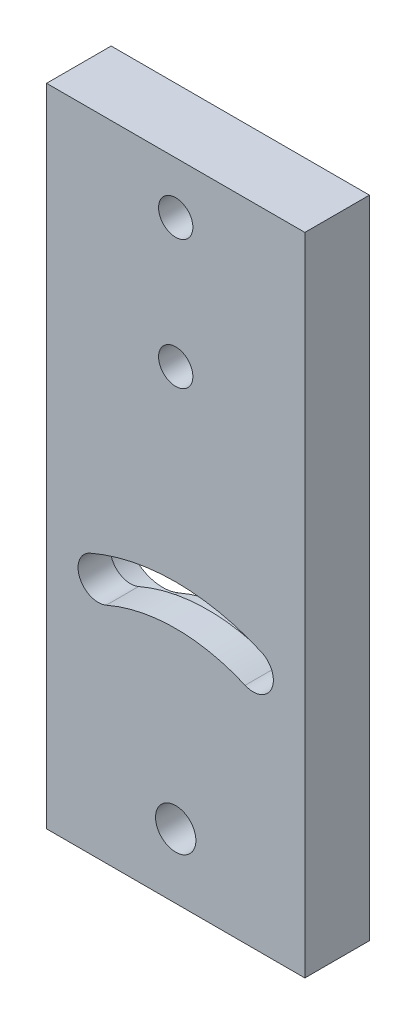
ISO-10303-21;
HEADER;
FILE_DESCRIPTION(('STEP AP214'),'2;1');
FILE_NAME('part.step','',(''),(''),'','','');
FILE_SCHEMA(('AUTOMOTIVE_DESIGN { 1 0 10303 214 1 1 1 1 }'));
ENDSEC;
DATA;
#1=APPLICATION_CONTEXT('core data for automotive mechanical design processes');
#2=APPLICATION_PROTOCOL_DEFINITION('international standard','automotive_design',2000,#1);
#3=PRODUCT_CONTEXT('',#1,'mechanical');
#4=PRODUCT('Part','Part','',(#3));
#5=PRODUCT_RELATED_PRODUCT_CATEGORY('part','',(#4));
#6=PRODUCT_DEFINITION_FORMATION('','',#4);
#7=PRODUCT_DEFINITION_CONTEXT('part definition',#1,'design');
#8=PRODUCT_DEFINITION('design','',#6,#7);
#9=PRODUCT_DEFINITION_SHAPE('','',#8);
#10=(LENGTH_UNIT() NAMED_UNIT(*) SI_UNIT(.MILLI.,.METRE.));
#11=(NAMED_UNIT(*) PLANE_ANGLE_UNIT() SI_UNIT($,.RADIAN.));
#12=(NAMED_UNIT(*) SI_UNIT($,.STERADIAN.) SOLID_ANGLE_UNIT());
#13=UNCERTAINTY_MEASURE_WITH_UNIT(LENGTH_MEASURE(1.E-05),#10,'distance_accuracy_value','');
#14=(GEOMETRIC_REPRESENTATION_CONTEXT(3) GLOBAL_UNCERTAINTY_ASSIGNED_CONTEXT((#13)) GLOBAL_UNIT_ASSIGNED_CONTEXT((#10,
#11,#12)) REPRESENTATION_CONTEXT('',''));
#15=CARTESIAN_POINT('',(0.,0.,0.));
#16=DIRECTION('',(0.,0.,1.));
#17=DIRECTION('',(1.,0.,0.));
#18=AXIS2_PLACEMENT_3D('',#15,#16,#17);
#19=CARTESIAN_POINT('',(0.,0.,12.7));
#20=DIRECTION('',(0.,0.,1.));
#21=DIRECTION('',(1.,0.,0.));
#22=AXIS2_PLACEMENT_3D('',#19,#20,#21);
#23=PLANE('',#22);
#24=CARTESIAN_POINT('',(25.4,116.84,12.7));
#25=DIRECTION('',(0.,0.,1.));
#26=DIRECTION('',(1.,0.,0.));
#27=AXIS2_PLACEMENT_3D('',#24,#25,#26);
#28=CIRCLE('',#27,3.3734375);
#29=CARTESIAN_POINT('',(28.7734375,116.84,12.7));
#30=VERTEX_POINT('',#29);
#31=EDGE_CURVE('E324',#30,#30,#28,.T.);
#32=ORIENTED_EDGE('',*,*,#31,.F.);
#33=EDGE_LOOP('',(#32));
#34=FACE_BOUND('',#33,.T.);
#35=DIRECTION('',(1.,0.,0.));
#36=VECTOR('',#35,1.);
#37=CARTESIAN_POINT('',(0.,127.,12.7));
#38=LINE('',#37,#36);
#39=CARTESIAN_POINT('',(0.,127.,12.7));
#40=VERTEX_POINT('',#39);
#41=CARTESIAN_POINT('',(50.8,127.,12.7));
#42=VERTEX_POINT('',#41);
#43=EDGE_CURVE('E264',#40,#42,#38,.T.);
#44=ORIENTED_EDGE('',*,*,#43,.F.);
#45=DIRECTION('',(0.,1.,0.));
#46=VECTOR('',#45,1.);
#47=CARTESIAN_POINT('',(0.,0.,12.7));
#48=LINE('',#47,#46);
#49=CARTESIAN_POINT('',(0.,0.,12.7));
#50=VERTEX_POINT('',#49);
#51=EDGE_CURVE('E275',#50,#40,#48,.T.);
#52=ORIENTED_EDGE('',*,*,#51,.F.);
#53=DIRECTION('',(1.,0.,0.));
#54=VECTOR('',#53,1.);
#55=CARTESIAN_POINT('',(0.,0.,12.7));
#56=LINE('',#55,#54);
#57=CARTESIAN_POINT('',(50.8,0.,12.7));
#58=VERTEX_POINT('',#57);
#59=EDGE_CURVE('E272',#50,#58,#56,.T.);
#60=ORIENTED_EDGE('',*,*,#59,.T.);
#61=DIRECTION('',(0.,1.,0.));
#62=VECTOR('',#61,1.);
#63=CARTESIAN_POINT('',(50.8,0.,12.7));
#64=LINE('',#63,#62);
#65=EDGE_CURVE('E268',#58,#42,#64,.T.);
#66=ORIENTED_EDGE('',*,*,#65,.T.);
#67=EDGE_LOOP('',(#44,#52,#60,#66));
#68=FACE_BOUND('',#67,.T.);
#69=CARTESIAN_POINT('',(25.4,12.7,12.7));
#70=DIRECTION('',(0.,0.,1.));
#71=DIRECTION('',(1.,0.,0.));
#72=AXIS2_PLACEMENT_3D('',#69,#70,#71);
#73=CIRCLE('',#72,34.13125);
#74=CARTESIAN_POINT('',(39.0525,43.9818073376923,12.7));
#75=VERTEX_POINT('',#74);
#76=CARTESIAN_POINT('',(11.7475,43.9818073376923,12.7));
#77=VERTEX_POINT('',#76);
#78=EDGE_CURVE('E323',#75,#77,#73,.T.);
#79=ORIENTED_EDGE('',*,*,#78,.T.);
#80=CARTESIAN_POINT('',(10.16,47.6192267955635,12.7));
#81=DIRECTION('',(0.,0.,1.));
#82=DIRECTION('',(1.,0.,0.));
#83=AXIS2_PLACEMENT_3D('',#80,#81,#82);
#84=CIRCLE('',#83,3.96875000000001);
#85=CARTESIAN_POINT('',(8.57249999999999,51.2566462534347,12.7));
#86=VERTEX_POINT('',#85);
#87=EDGE_CURVE('E251',#86,#77,#84,.T.);
#88=ORIENTED_EDGE('',*,*,#87,.F.);
#89=CARTESIAN_POINT('',(25.4,12.7,12.7));
#90=DIRECTION('',(0.,0.,1.));
#91=DIRECTION('',(1.,0.,0.));
#92=AXIS2_PLACEMENT_3D('',#89,#90,#91);
#93=CIRCLE('',#92,42.06875);
#94=CARTESIAN_POINT('',(42.2275,51.2566462534347,12.7));
#95=VERTEX_POINT('',#94);
#96=EDGE_CURVE('E260',#95,#86,#93,.T.);
#97=ORIENTED_EDGE('',*,*,#96,.F.);
#98=CARTESIAN_POINT('',(40.64,47.6192267955635,12.7));
#99=DIRECTION('',(0.,0.,1.));
#100=DIRECTION('',(1.,0.,0.));
#101=AXIS2_PLACEMENT_3D('',#98,#99,#100);
#102=CIRCLE('',#101,3.96875);
#103=EDGE_CURVE('E254',#75,#95,#102,.T.);
#104=ORIENTED_EDGE('',*,*,#103,.F.);
#105=EDGE_LOOP('',(#79,#88,#97,#104));
#106=FACE_BOUND('',#105,.T.);
#107=CARTESIAN_POINT('',(25.4,91.44,12.7));
#108=DIRECTION('',(0.,0.,1.));
#109=DIRECTION('',(1.,0.,0.));
#110=AXIS2_PLACEMENT_3D('',#107,#108,#109);
#111=CIRCLE('',#110,3.3734375);
#112=CARTESIAN_POINT('',(28.7734375,91.44,12.7));
#113=VERTEX_POINT('',#112);
#114=EDGE_CURVE('E320',#113,#113,#111,.T.);
#115=ORIENTED_EDGE('',*,*,#114,.F.);
#116=EDGE_LOOP('',(#115));
#117=FACE_BOUND('',#116,.T.);
#118=CARTESIAN_POINT('',(25.4,12.7,12.7));
#119=DIRECTION('',(0.,0.,1.));
#120=DIRECTION('',(1.,0.,0.));
#121=AXIS2_PLACEMENT_3D('',#118,#119,#120);
#122=CIRCLE('',#121,3.96875);
#123=CARTESIAN_POINT('',(29.36875,12.7,12.7));
#124=VERTEX_POINT('',#123);
#125=EDGE_CURVE('E330',#124,#124,#122,.T.);
#126=ORIENTED_EDGE('',*,*,#125,.F.);
#127=EDGE_LOOP('',(#126));
#128=FACE_BOUND('',#127,.T.);
#129=ADVANCED_FACE('F138',(#34,#68,#106,#117,#128),#23,.T.);
#130=CARTESIAN_POINT('',(0.,0.,0.));
#131=DIRECTION('',(0.,0.,1.));
#132=DIRECTION('',(1.,0.,0.));
#133=AXIS2_PLACEMENT_3D('',#130,#131,#132);
#134=PLANE('',#133);
#135=CARTESIAN_POINT('',(25.4,12.7,0.));
#136=DIRECTION('',(0.,0.,1.));
#137=DIRECTION('',(1.,0.,0.));
#138=AXIS2_PLACEMENT_3D('',#135,#136,#137);
#139=CIRCLE('',#138,7.62);
#140=CARTESIAN_POINT('',(33.02,12.7,0.));
#141=VERTEX_POINT('',#140);
#142=EDGE_CURVE('E419',#141,#141,#139,.T.);
#143=ORIENTED_EDGE('',*,*,#142,.T.);
#144=EDGE_LOOP('',(#143));
#145=FACE_BOUND('',#144,.T.);
#146=CARTESIAN_POINT('',(25.4,116.84,0.));
#147=DIRECTION('',(0.,0.,1.));
#148=DIRECTION('',(1.,0.,0.));
#149=AXIS2_PLACEMENT_3D('',#146,#147,#148);
#150=CIRCLE('',#149,5.55625);
#151=CARTESIAN_POINT('',(30.95625,116.84,0.));
#152=VERTEX_POINT('',#151);
#153=EDGE_CURVE('E412',#152,#152,#150,.T.);
#154=ORIENTED_EDGE('',*,*,#153,.T.);
#155=EDGE_LOOP('',(#154));
#156=FACE_BOUND('',#155,.T.);
#157=CARTESIAN_POINT('',(25.4,91.44,0.));
#158=DIRECTION('',(0.,0.,1.));
#159=DIRECTION('',(1.,0.,0.));
#160=AXIS2_PLACEMENT_3D('',#157,#158,#159);
#161=CIRCLE('',#160,5.55625);
#162=CARTESIAN_POINT('',(30.95625,91.44,0.));
#163=VERTEX_POINT('',#162);
#164=EDGE_CURVE('E408',#163,#163,#161,.T.);
#165=ORIENTED_EDGE('',*,*,#164,.T.);
#166=EDGE_LOOP('',(#165));
#167=FACE_BOUND('',#166,.T.);
#168=CARTESIAN_POINT('',(10.16,47.6192267955635,0.));
#169=DIRECTION('',(0.,0.,1.));
#170=DIRECTION('',(1.,0.,0.));
#171=AXIS2_PLACEMENT_3D('',#168,#169,#170);
#172=CIRCLE('',#171,7.77875000000001);
#173=CARTESIAN_POINT('',(7.0485,54.7485689329911,0.));
#174=VERTEX_POINT('',#173);
#175=CARTESIAN_POINT('',(13.2715,40.4898846581359,0.));
#176=VERTEX_POINT('',#175);
#177=EDGE_CURVE('E383',#174,#176,#172,.T.);
#178=ORIENTED_EDGE('',*,*,#177,.T.);
#179=CARTESIAN_POINT('',(25.4,12.7,0.));
#180=DIRECTION('',(0.,0.,1.));
#181=DIRECTION('',(1.,0.,0.));
#182=AXIS2_PLACEMENT_3D('',#179,#180,#181);
#183=CIRCLE('',#182,30.32125);
#184=CARTESIAN_POINT('',(37.5285,40.4898846581359,0.));
#185=VERTEX_POINT('',#184);
#186=EDGE_CURVE('E156',#185,#176,#183,.T.);
#187=ORIENTED_EDGE('',*,*,#186,.F.);
#188=CARTESIAN_POINT('',(40.64,47.6192267955635,0.));
#189=DIRECTION('',(0.,0.,1.));
#190=DIRECTION('',(1.,0.,0.));
#191=AXIS2_PLACEMENT_3D('',#188,#189,#190);
#192=CIRCLE('',#191,7.77875);
#193=CARTESIAN_POINT('',(43.7515,54.7485689329911,0.));
#194=VERTEX_POINT('',#193);
#195=EDGE_CURVE('E374',#185,#194,#192,.T.);
#196=ORIENTED_EDGE('',*,*,#195,.T.);
#197=CARTESIAN_POINT('',(25.4,12.7,0.));
#198=DIRECTION('',(0.,0.,1.));
#199=DIRECTION('',(1.,0.,0.));
#200=AXIS2_PLACEMENT_3D('',#197,#198,#199);
#201=CIRCLE('',#200,45.87875);
#202=EDGE_CURVE('E379',#194,#174,#201,.T.);
#203=ORIENTED_EDGE('',*,*,#202,.T.);
#204=EDGE_LOOP('',(#178,#187,#196,#203));
#205=FACE_BOUND('',#204,.T.);
#206=DIRECTION('',(1.,0.,0.));
#207=VECTOR('',#206,1.);
#208=CARTESIAN_POINT('',(0.,127.,0.));
#209=LINE('',#208,#207);
#210=CARTESIAN_POINT('',(0.,127.,0.));
#211=VERTEX_POINT('',#210);
#212=CARTESIAN_POINT('',(50.8,127.,0.));
#213=VERTEX_POINT('',#212);
#214=EDGE_CURVE('E280',#211,#213,#209,.T.);
#215=ORIENTED_EDGE('',*,*,#214,.T.);
#216=DIRECTION('',(0.,1.,0.));
#217=VECTOR('',#216,1.);
#218=CARTESIAN_POINT('',(50.8,0.,0.));
#219=LINE('',#218,#217);
#220=CARTESIAN_POINT('',(50.8,0.,0.));
#221=VERTEX_POINT('',#220);
#222=EDGE_CURVE('E284',#221,#213,#219,.T.);
#223=ORIENTED_EDGE('',*,*,#222,.F.);
#224=DIRECTION('',(1.,0.,0.));
#225=VECTOR('',#224,1.);
#226=CARTESIAN_POINT('',(0.,0.,0.));
#227=LINE('',#226,#225);
#228=CARTESIAN_POINT('',(0.,0.,0.));
#229=VERTEX_POINT('',#228);
#230=EDGE_CURVE('E288',#229,#221,#227,.T.);
#231=ORIENTED_EDGE('',*,*,#230,.F.);
#232=DIRECTION('',(0.,1.,0.));
#233=VECTOR('',#232,1.);
#234=CARTESIAN_POINT('',(0.,0.,0.));
#235=LINE('',#234,#233);
#236=EDGE_CURVE('E269',#229,#211,#235,.T.);
#237=ORIENTED_EDGE('',*,*,#236,.T.);
#238=EDGE_LOOP('',(#215,#223,#231,#237));
#239=FACE_BOUND('',#238,.T.);
#240=ADVANCED_FACE('F352',(#145,#156,#167,#205,#239),#134,.F.);
#241=CARTESIAN_POINT('',(0.,127.,12.7));
#242=DIRECTION('',(0.,1.,0.));
#243=DIRECTION('',(0.,0.,1.));
#244=AXIS2_PLACEMENT_3D('',#241,#242,#243);
#245=PLANE('',#244);
#246=ORIENTED_EDGE('',*,*,#214,.F.);
#247=DIRECTION('',(0.,0.,-1.));
#248=VECTOR('',#247,1.);
#249=CARTESIAN_POINT('',(0.,127.,12.7));
#250=LINE('',#249,#248);
#251=EDGE_CURVE('E12',#40,#211,#250,.T.);
#252=ORIENTED_EDGE('',*,*,#251,.F.);
#253=ORIENTED_EDGE('',*,*,#43,.T.);
#254=DIRECTION('',(0.,0.,-1.));
#255=VECTOR('',#254,1.);
#256=CARTESIAN_POINT('',(50.8,127.,12.7));
#257=LINE('',#256,#255);
#258=EDGE_CURVE('E279',#42,#213,#257,.T.);
#259=ORIENTED_EDGE('',*,*,#258,.T.);
#260=EDGE_LOOP('',(#246,#252,#253,#259));
#261=FACE_BOUND('',#260,.T.);
#262=ADVANCED_FACE('F140',(#261),#245,.T.);
#263=CARTESIAN_POINT('',(0.,0.,12.7));
#264=DIRECTION('',(-1.,0.,0.));
#265=DIRECTION('',(0.,0.,1.));
#266=AXIS2_PLACEMENT_3D('',#263,#264,#265);
#267=PLANE('',#266);
#268=ORIENTED_EDGE('',*,*,#236,.F.);
#269=DIRECTION('',(0.,0.,-1.));
#270=VECTOR('',#269,1.);
#271=CARTESIAN_POINT('',(0.,0.,12.7));
#272=LINE('',#271,#270);
#273=EDGE_CURVE('E148',#50,#229,#272,.T.);
#274=ORIENTED_EDGE('',*,*,#273,.F.);
#275=ORIENTED_EDGE('',*,*,#51,.T.);
#276=ORIENTED_EDGE('',*,*,#251,.T.);
#277=EDGE_LOOP('',(#268,#274,#275,#276));
#278=FACE_BOUND('',#277,.T.);
#279=ADVANCED_FACE('F462',(#278),#267,.T.);
#280=CARTESIAN_POINT('',(0.,0.,12.7));
#281=DIRECTION('',(0.,1.,0.));
#282=DIRECTION('',(0.,0.,1.));
#283=AXIS2_PLACEMENT_3D('',#280,#281,#282);
#284=PLANE('',#283);
#285=ORIENTED_EDGE('',*,*,#230,.T.);
#286=DIRECTION('',(0.,0.,-1.));
#287=VECTOR('',#286,1.);
#288=CARTESIAN_POINT('',(50.8,0.,12.7));
#289=LINE('',#288,#287);
#290=EDGE_CURVE('E296',#58,#221,#289,.T.);
#291=ORIENTED_EDGE('',*,*,#290,.F.);
#292=ORIENTED_EDGE('',*,*,#59,.F.);
#293=ORIENTED_EDGE('',*,*,#273,.T.);
#294=EDGE_LOOP('',(#285,#291,#292,#293));
#295=FACE_BOUND('',#294,.T.);
#296=ADVANCED_FACE('F465',(#295),#284,.F.);
#297=CARTESIAN_POINT('',(50.8,0.,12.7));
#298=DIRECTION('',(-1.,0.,0.));
#299=DIRECTION('',(0.,0.,1.));
#300=AXIS2_PLACEMENT_3D('',#297,#298,#299);
#301=PLANE('',#300);
#302=ORIENTED_EDGE('',*,*,#222,.T.);
#303=ORIENTED_EDGE('',*,*,#258,.F.);
#304=ORIENTED_EDGE('',*,*,#65,.F.);
#305=ORIENTED_EDGE('',*,*,#290,.T.);
#306=EDGE_LOOP('',(#302,#303,#304,#305));
#307=FACE_BOUND('',#306,.T.);
#308=ADVANCED_FACE('F458',(#307),#301,.F.);
#309=CARTESIAN_POINT('',(25.4,12.7,12.7));
#310=DIRECTION('',(0.,0.,-1.));
#311=DIRECTION('',(-1.,0.,0.));
#312=AXIS2_PLACEMENT_3D('',#309,#310,#311);
#313=CYLINDRICAL_SURFACE('',#312,34.13125);
#314=DIRECTION('',(0.,0.,-1.));
#315=VECTOR('',#314,1.);
#316=CARTESIAN_POINT('',(39.0525,43.9818073376923,12.7));
#317=LINE('',#316,#315);
#318=CARTESIAN_POINT('',(39.0525,43.9818073376923,6.35));
#319=VERTEX_POINT('',#318);
#320=EDGE_CURVE('E245',#75,#319,#317,.T.);
#321=ORIENTED_EDGE('',*,*,#320,.T.);
#322=CARTESIAN_POINT('',(25.4,12.7,6.35));
#323=DIRECTION('',(0.,0.,1.));
#324=DIRECTION('',(1.,0.,0.));
#325=AXIS2_PLACEMENT_3D('',#322,#323,#324);
#326=CIRCLE('',#325,34.13125);
#327=CARTESIAN_POINT('',(11.7475,43.9818073376923,6.35));
#328=VERTEX_POINT('',#327);
#329=EDGE_CURVE('E231',#319,#328,#326,.T.);
#330=ORIENTED_EDGE('',*,*,#329,.T.);
#331=DIRECTION('',(0.,0.,-1.));
#332=VECTOR('',#331,1.);
#333=CARTESIAN_POINT('',(11.7475,43.9818073376923,12.7));
#334=LINE('',#333,#332);
#335=EDGE_CURVE('E243',#77,#328,#334,.T.);
#336=ORIENTED_EDGE('',*,*,#335,.F.);
#337=ORIENTED_EDGE('',*,*,#78,.F.);
#338=EDGE_LOOP('',(#321,#330,#336,#337));
#339=FACE_BOUND('',#338,.T.);
#340=ADVANCED_FACE('F241',(#339),#313,.T.);
#341=CARTESIAN_POINT('',(40.64,47.6192267955635,12.7));
#342=DIRECTION('',(0.,0.,-1.));
#343=DIRECTION('',(-1.,0.,0.));
#344=AXIS2_PLACEMENT_3D('',#341,#342,#343);
#345=CYLINDRICAL_SURFACE('',#344,3.96875);
#346=CARTESIAN_POINT('',(40.64,47.6192267955635,6.35));
#347=DIRECTION('',(0.,0.,1.));
#348=DIRECTION('',(1.,0.,0.));
#349=AXIS2_PLACEMENT_3D('',#346,#347,#348);
#350=CIRCLE('',#349,3.96875);
#351=CARTESIAN_POINT('',(42.2275,51.2566462534347,6.35));
#352=VERTEX_POINT('',#351);
#353=EDGE_CURVE('E345',#319,#352,#350,.T.);
#354=ORIENTED_EDGE('',*,*,#353,.F.);
#355=ORIENTED_EDGE('',*,*,#320,.F.);
#356=ORIENTED_EDGE('',*,*,#103,.T.);
#357=DIRECTION('',(0.,0.,-1.));
#358=VECTOR('',#357,1.);
#359=CARTESIAN_POINT('',(42.2275,51.2566462534347,12.7));
#360=LINE('',#359,#358);
#361=EDGE_CURVE('E258',#95,#352,#360,.T.);
#362=ORIENTED_EDGE('',*,*,#361,.T.);
#363=EDGE_LOOP('',(#354,#355,#356,#362));
#364=FACE_BOUND('',#363,.T.);
#365=ADVANCED_FACE('F344',(#364),#345,.F.);
#366=CARTESIAN_POINT('',(25.4,12.7,12.7));
#367=DIRECTION('',(0.,0.,-1.));
#368=DIRECTION('',(-1.,0.,0.));
#369=AXIS2_PLACEMENT_3D('',#366,#367,#368);
#370=CYLINDRICAL_SURFACE('',#369,42.06875);
#371=CARTESIAN_POINT('',(25.4,12.7,6.35));
#372=DIRECTION('',(0.,0.,1.));
#373=DIRECTION('',(1.,0.,0.));
#374=AXIS2_PLACEMENT_3D('',#371,#372,#373);
#375=CIRCLE('',#374,42.06875);
#376=CARTESIAN_POINT('',(8.5725,51.2566462534347,6.35));
#377=VERTEX_POINT('',#376);
#378=EDGE_CURVE('E164',#352,#377,#375,.T.);
#379=ORIENTED_EDGE('',*,*,#378,.F.);
#380=ORIENTED_EDGE('',*,*,#361,.F.);
#381=ORIENTED_EDGE('',*,*,#96,.T.);
#382=DIRECTION('',(0.,0.,-1.));
#383=VECTOR('',#382,1.);
#384=CARTESIAN_POINT('',(8.5725,51.2566462534347,12.7));
#385=LINE('',#384,#383);
#386=EDGE_CURVE('E253',#86,#377,#385,.T.);
#387=ORIENTED_EDGE('',*,*,#386,.T.);
#388=EDGE_LOOP('',(#379,#380,#381,#387));
#389=FACE_BOUND('',#388,.T.);
#390=ADVANCED_FACE('F349',(#389),#370,.F.);
#391=CARTESIAN_POINT('',(10.16,47.6192267955635,12.7));
#392=DIRECTION('',(0.,0.,-1.));
#393=DIRECTION('',(-1.,0.,0.));
#394=AXIS2_PLACEMENT_3D('',#391,#392,#393);
#395=CYLINDRICAL_SURFACE('',#394,3.96875000000001);
#396=CARTESIAN_POINT('',(10.16,47.6192267955635,6.35));
#397=DIRECTION('',(0.,0.,1.));
#398=DIRECTION('',(1.,0.,0.));
#399=AXIS2_PLACEMENT_3D('',#396,#397,#398);
#400=CIRCLE('',#399,3.96875000000001);
#401=EDGE_CURVE('E227',#377,#328,#400,.T.);
#402=ORIENTED_EDGE('',*,*,#401,.F.);
#403=ORIENTED_EDGE('',*,*,#386,.F.);
#404=ORIENTED_EDGE('',*,*,#87,.T.);
#405=ORIENTED_EDGE('',*,*,#335,.T.);
#406=EDGE_LOOP('',(#402,#403,#404,#405));
#407=FACE_BOUND('',#406,.T.);
#408=ADVANCED_FACE('F249',(#407),#395,.F.);
#409=CARTESIAN_POINT('',(25.4,91.44,12.7));
#410=DIRECTION('',(0.,0.,-1.));
#411=DIRECTION('',(-1.,0.,0.));
#412=AXIS2_PLACEMENT_3D('',#409,#410,#411);
#413=CYLINDRICAL_SURFACE('',#412,3.3734375);
#414=CARTESIAN_POINT('',(25.4,91.44,6.35));
#415=DIRECTION('',(0.,0.,1.));
#416=DIRECTION('',(1.,0.,0.));
#417=AXIS2_PLACEMENT_3D('',#414,#415,#416);
#418=CIRCLE('',#417,3.3734375);
#419=CARTESIAN_POINT('',(28.7734375,91.44,6.35));
#420=VERTEX_POINT('',#419);
#421=EDGE_CURVE('E247',#420,#420,#418,.T.);
#422=ORIENTED_EDGE('',*,*,#421,.F.);
#423=EDGE_LOOP('',(#422));
#424=FACE_BOUND('',#423,.T.);
#425=ORIENTED_EDGE('',*,*,#114,.T.);
#426=EDGE_LOOP('',(#425));
#427=FACE_BOUND('',#426,.T.);
#428=ADVANCED_FACE('F313',(#424,#427),#413,.F.);
#429=CARTESIAN_POINT('',(25.4,116.84,12.7));
#430=DIRECTION('',(0.,0.,-1.));
#431=DIRECTION('',(-1.,0.,0.));
#432=AXIS2_PLACEMENT_3D('',#429,#430,#431);
#433=CYLINDRICAL_SURFACE('',#432,3.3734375);
#434=CARTESIAN_POINT('',(25.4,116.84,6.35));
#435=DIRECTION('',(0.,0.,1.));
#436=DIRECTION('',(1.,0.,0.));
#437=AXIS2_PLACEMENT_3D('',#434,#435,#436);
#438=CIRCLE('',#437,3.3734375);
#439=CARTESIAN_POINT('',(28.7734375,116.84,6.35));
#440=VERTEX_POINT('',#439);
#441=EDGE_CURVE('E302',#440,#440,#438,.T.);
#442=ORIENTED_EDGE('',*,*,#441,.F.);
#443=EDGE_LOOP('',(#442));
#444=FACE_BOUND('',#443,.T.);
#445=ORIENTED_EDGE('',*,*,#31,.T.);
#446=EDGE_LOOP('',(#445));
#447=FACE_BOUND('',#446,.T.);
#448=ADVANCED_FACE('F316',(#444,#447),#433,.F.);
#449=CARTESIAN_POINT('',(25.4,12.7,12.7));
#450=DIRECTION('',(0.,0.,-1.));
#451=DIRECTION('',(-1.,0.,0.));
#452=AXIS2_PLACEMENT_3D('',#449,#450,#451);
#453=CYLINDRICAL_SURFACE('',#452,3.96875);
#454=CARTESIAN_POINT('',(25.4,12.7,6.35));
#455=DIRECTION('',(0.,0.,1.));
#456=DIRECTION('',(1.,0.,0.));
#457=AXIS2_PLACEMENT_3D('',#454,#455,#456);
#458=CIRCLE('',#457,3.96875);
#459=CARTESIAN_POINT('',(29.36875,12.7,6.35));
#460=VERTEX_POINT('',#459);
#461=EDGE_CURVE('E142',#460,#460,#458,.T.);
#462=ORIENTED_EDGE('',*,*,#461,.F.);
#463=EDGE_LOOP('',(#462));
#464=FACE_BOUND('',#463,.T.);
#465=ORIENTED_EDGE('',*,*,#125,.T.);
#466=EDGE_LOOP('',(#465));
#467=FACE_BOUND('',#466,.T.);
#468=ADVANCED_FACE('F435',(#464,#467),#453,.F.);
#469=CARTESIAN_POINT('',(25.4,12.7,6.35));
#470=DIRECTION('',(0.,0.,-1.));
#471=DIRECTION('',(-1.,0.,0.));
#472=AXIS2_PLACEMENT_3D('',#469,#470,#471);
#473=CYLINDRICAL_SURFACE('',#472,30.32125);
#474=ORIENTED_EDGE('',*,*,#186,.T.);
#475=DIRECTION('',(0.,0.,-1.));
#476=VECTOR('',#475,1.);
#477=CARTESIAN_POINT('',(13.2715,40.4898846581359,6.35));
#478=LINE('',#477,#476);
#479=CARTESIAN_POINT('',(13.2715,40.4898846581359,6.35));
#480=VERTEX_POINT('',#479);
#481=EDGE_CURVE('E365',#480,#176,#478,.T.);
#482=ORIENTED_EDGE('',*,*,#481,.F.);
#483=CARTESIAN_POINT('',(25.4,12.7,6.35));
#484=DIRECTION('',(0.,0.,1.));
#485=DIRECTION('',(1.,0.,0.));
#486=AXIS2_PLACEMENT_3D('',#483,#484,#485);
#487=CIRCLE('',#486,30.32125);
#488=CARTESIAN_POINT('',(37.5285,40.4898846581359,6.35));
#489=VERTEX_POINT('',#488);
#490=EDGE_CURVE('E378',#489,#480,#487,.T.);
#491=ORIENTED_EDGE('',*,*,#490,.F.);
#492=DIRECTION('',(0.,0.,-1.));
#493=VECTOR('',#492,1.);
#494=CARTESIAN_POINT('',(37.5285,40.4898846581359,6.35));
#495=LINE('',#494,#493);
#496=EDGE_CURVE('E360',#489,#185,#495,.T.);
#497=ORIENTED_EDGE('',*,*,#496,.T.);
#498=EDGE_LOOP('',(#474,#482,#491,#497));
#499=FACE_BOUND('',#498,.T.);
#500=ADVANCED_FACE('F437',(#499),#473,.T.);
#501=CARTESIAN_POINT('',(40.64,47.6192267955635,6.35));
#502=DIRECTION('',(0.,0.,-1.));
#503=DIRECTION('',(-1.,0.,0.));
#504=AXIS2_PLACEMENT_3D('',#501,#502,#503);
#505=CYLINDRICAL_SURFACE('',#504,7.77875);
#506=ORIENTED_EDGE('',*,*,#195,.F.);
#507=ORIENTED_EDGE('',*,*,#496,.F.);
#508=CARTESIAN_POINT('',(40.64,47.6192267955635,6.35));
#509=DIRECTION('',(0.,0.,1.));
#510=DIRECTION('',(1.,0.,0.));
#511=AXIS2_PLACEMENT_3D('',#508,#509,#510);
#512=CIRCLE('',#511,7.77875);
#513=CARTESIAN_POINT('',(43.7515,54.7485689329911,6.35));
#514=VERTEX_POINT('',#513);
#515=EDGE_CURVE('E369',#489,#514,#512,.T.);
#516=ORIENTED_EDGE('',*,*,#515,.T.);
#517=DIRECTION('',(0.,0.,-1.));
#518=VECTOR('',#517,1.);
#519=CARTESIAN_POINT('',(43.7515,54.7485689329911,6.35));
#520=LINE('',#519,#518);
#521=EDGE_CURVE('E362',#514,#194,#520,.T.);
#522=ORIENTED_EDGE('',*,*,#521,.T.);
#523=EDGE_LOOP('',(#506,#507,#516,#522));
#524=FACE_BOUND('',#523,.T.);
#525=ADVANCED_FACE('F444',(#524),#505,.F.);
#526=CARTESIAN_POINT('',(25.4,12.7,6.35));
#527=DIRECTION('',(0.,0.,-1.));
#528=DIRECTION('',(-1.,0.,0.));
#529=AXIS2_PLACEMENT_3D('',#526,#527,#528);
#530=CYLINDRICAL_SURFACE('',#529,45.87875);
#531=ORIENTED_EDGE('',*,*,#202,.F.);
#532=ORIENTED_EDGE('',*,*,#521,.F.);
#533=CARTESIAN_POINT('',(25.4,12.7,6.35));
#534=DIRECTION('',(0.,0.,1.));
#535=DIRECTION('',(1.,0.,0.));
#536=AXIS2_PLACEMENT_3D('',#533,#534,#535);
#537=CIRCLE('',#536,45.87875);
#538=CARTESIAN_POINT('',(7.0485,54.7485689329911,6.35));
#539=VERTEX_POINT('',#538);
#540=EDGE_CURVE('E391',#514,#539,#537,.T.);
#541=ORIENTED_EDGE('',*,*,#540,.T.);
#542=DIRECTION('',(0.,0.,-1.));
#543=VECTOR('',#542,1.);
#544=CARTESIAN_POINT('',(7.0485,54.7485689329911,6.35));
#545=LINE('',#544,#543);
#546=EDGE_CURVE('E368',#539,#174,#545,.T.);
#547=ORIENTED_EDGE('',*,*,#546,.T.);
#548=EDGE_LOOP('',(#531,#532,#541,#547));
#549=FACE_BOUND('',#548,.T.);
#550=ADVANCED_FACE('F564',(#549),#530,.F.);
#551=CARTESIAN_POINT('',(10.16,47.6192267955635,6.35));
#552=DIRECTION('',(0.,0.,-1.));
#553=DIRECTION('',(-1.,0.,0.));
#554=AXIS2_PLACEMENT_3D('',#551,#552,#553);
#555=CYLINDRICAL_SURFACE('',#554,7.77875000000001);
#556=ORIENTED_EDGE('',*,*,#177,.F.);
#557=ORIENTED_EDGE('',*,*,#546,.F.);
#558=CARTESIAN_POINT('',(10.16,47.6192267955635,6.35));
#559=DIRECTION('',(0.,0.,1.));
#560=DIRECTION('',(1.,0.,0.));
#561=AXIS2_PLACEMENT_3D('',#558,#559,#560);
#562=CIRCLE('',#561,7.77875000000001);
#563=EDGE_CURVE('E394',#539,#480,#562,.T.);
#564=ORIENTED_EDGE('',*,*,#563,.T.);
#565=ORIENTED_EDGE('',*,*,#481,.T.);
#566=EDGE_LOOP('',(#556,#557,#564,#565));
#567=FACE_BOUND('',#566,.T.);
#568=ADVANCED_FACE('F574',(#567),#555,.F.);
#569=CARTESIAN_POINT('',(17.78,30.1596133977818,6.35));
#570=DIRECTION('',(0.,0.,1.));
#571=DIRECTION('',(1.,0.,0.));
#572=AXIS2_PLACEMENT_3D('',#569,#570,#571);
#573=PLANE('',#572);
#574=ORIENTED_EDGE('',*,*,#329,.F.);
#575=ORIENTED_EDGE('',*,*,#353,.T.);
#576=ORIENTED_EDGE('',*,*,#378,.T.);
#577=ORIENTED_EDGE('',*,*,#401,.T.);
#578=EDGE_LOOP('',(#574,#575,#576,#577));
#579=FACE_BOUND('',#578,.T.);
#580=ORIENTED_EDGE('',*,*,#490,.T.);
#581=ORIENTED_EDGE('',*,*,#563,.F.);
#582=ORIENTED_EDGE('',*,*,#540,.F.);
#583=ORIENTED_EDGE('',*,*,#515,.F.);
#584=EDGE_LOOP('',(#580,#581,#582,#583));
#585=FACE_BOUND('',#584,.T.);
#586=ADVANCED_FACE('F229',(#579,#585),#573,.F.);
#587=CARTESIAN_POINT('',(25.4,116.84,6.35));
#588=DIRECTION('',(0.,0.,-1.));
#589=DIRECTION('',(-1.,0.,0.));
#590=AXIS2_PLACEMENT_3D('',#587,#588,#589);
#591=CYLINDRICAL_SURFACE('',#590,5.55625);
#592=CARTESIAN_POINT('',(25.4,116.84,6.35));
#593=DIRECTION('',(0.,0.,1.));
#594=DIRECTION('',(1.,0.,0.));
#595=AXIS2_PLACEMENT_3D('',#592,#593,#594);
#596=CIRCLE('',#595,5.55625);
#597=CARTESIAN_POINT('',(30.95625,116.84,6.35));
#598=VERTEX_POINT('',#597);
#599=EDGE_CURVE('E305',#598,#598,#596,.T.);
#600=ORIENTED_EDGE('',*,*,#599,.T.);
#601=EDGE_LOOP('',(#600));
#602=FACE_BOUND('',#601,.T.);
#603=ORIENTED_EDGE('',*,*,#153,.F.);
#604=EDGE_LOOP('',(#603));
#605=FACE_BOUND('',#604,.T.);
#606=ADVANCED_FACE('F591',(#602,#605),#591,.F.);
#607=CARTESIAN_POINT('',(25.4,116.84,6.35));
#608=DIRECTION('',(0.,0.,1.));
#609=DIRECTION('',(1.,0.,0.));
#610=AXIS2_PLACEMENT_3D('',#607,#608,#609);
#611=PLANE('',#610);
#612=ORIENTED_EDGE('',*,*,#441,.T.);
#613=EDGE_LOOP('',(#612));
#614=FACE_BOUND('',#613,.T.);
#615=ORIENTED_EDGE('',*,*,#599,.F.);
#616=EDGE_LOOP('',(#615));
#617=FACE_BOUND('',#616,.T.);
#618=ADVANCED_FACE('F599',(#614,#617),#611,.F.);
#619=CARTESIAN_POINT('',(25.4,91.44,6.35));
#620=DIRECTION('',(0.,0.,-1.));
#621=DIRECTION('',(-1.,0.,0.));
#622=AXIS2_PLACEMENT_3D('',#619,#620,#621);
#623=CYLINDRICAL_SURFACE('',#622,5.55625);
#624=CARTESIAN_POINT('',(25.4,91.44,6.35));
#625=DIRECTION('',(0.,0.,1.));
#626=DIRECTION('',(1.,0.,0.));
#627=AXIS2_PLACEMENT_3D('',#624,#625,#626);
#628=CIRCLE('',#627,5.55625);
#629=CARTESIAN_POINT('',(30.95625,91.44,6.35));
#630=VERTEX_POINT('',#629);
#631=EDGE_CURVE('E404',#630,#630,#628,.T.);
#632=ORIENTED_EDGE('',*,*,#631,.T.);
#633=EDGE_LOOP('',(#632));
#634=FACE_BOUND('',#633,.T.);
#635=ORIENTED_EDGE('',*,*,#164,.F.);
#636=EDGE_LOOP('',(#635));
#637=FACE_BOUND('',#636,.T.);
#638=ADVANCED_FACE('F609',(#634,#637),#623,.F.);
#639=CARTESIAN_POINT('',(25.4,91.44,6.35));
#640=DIRECTION('',(0.,0.,1.));
#641=DIRECTION('',(1.,0.,0.));
#642=AXIS2_PLACEMENT_3D('',#639,#640,#641);
#643=PLANE('',#642);
#644=ORIENTED_EDGE('',*,*,#421,.T.);
#645=EDGE_LOOP('',(#644));
#646=FACE_BOUND('',#645,.T.);
#647=ORIENTED_EDGE('',*,*,#631,.F.);
#648=EDGE_LOOP('',(#647));
#649=FACE_BOUND('',#648,.T.);
#650=ADVANCED_FACE('F310',(#646,#649),#643,.F.);
#651=CARTESIAN_POINT('',(25.4,12.7,6.35));
#652=DIRECTION('',(0.,0.,-1.));
#653=DIRECTION('',(-1.,0.,0.));
#654=AXIS2_PLACEMENT_3D('',#651,#652,#653);
#655=CYLINDRICAL_SURFACE('',#654,7.62);
#656=CARTESIAN_POINT('',(25.4,12.7,6.35));
#657=DIRECTION('',(0.,0.,1.));
#658=DIRECTION('',(1.,0.,0.));
#659=AXIS2_PLACEMENT_3D('',#656,#657,#658);
#660=CIRCLE('',#659,7.62);
#661=CARTESIAN_POINT('',(33.02,12.7,6.35));
#662=VERTEX_POINT('',#661);
#663=EDGE_CURVE('E423',#662,#662,#660,.T.);
#664=ORIENTED_EDGE('',*,*,#663,.T.);
#665=EDGE_LOOP('',(#664));
#666=FACE_BOUND('',#665,.T.);
#667=ORIENTED_EDGE('',*,*,#142,.F.);
#668=EDGE_LOOP('',(#667));
#669=FACE_BOUND('',#668,.T.);
#670=ADVANCED_FACE('F628',(#666,#669),#655,.F.);
#671=CARTESIAN_POINT('',(25.4,12.7,6.35));
#672=DIRECTION('',(0.,0.,1.));
#673=DIRECTION('',(1.,0.,0.));
#674=AXIS2_PLACEMENT_3D('',#671,#672,#673);
#675=PLANE('',#674);
#676=ORIENTED_EDGE('',*,*,#461,.T.);
#677=EDGE_LOOP('',(#676));
#678=FACE_BOUND('',#677,.T.);
#679=ORIENTED_EDGE('',*,*,#663,.F.);
#680=EDGE_LOOP('',(#679));
#681=FACE_BOUND('',#680,.T.);
#682=ADVANCED_FACE('F432',(#678,#681),#675,.F.);
#683=CLOSED_SHELL('',(#129,#240,#262,#279,#296,#308,#340,#365,#390,#408,#428,#448,#468,#500,
#525,#550,#568,#586,#606,#618,#638,#650,#670,#682));
#684=MANIFOLD_SOLID_BREP('B2',#683);
#685=ADVANCED_BREP_SHAPE_REPRESENTATION('',(#18,#684),#14);
#686=SHAPE_DEFINITION_REPRESENTATION(#9,#685);
ENDSEC;
END-ISO-10303-21;
